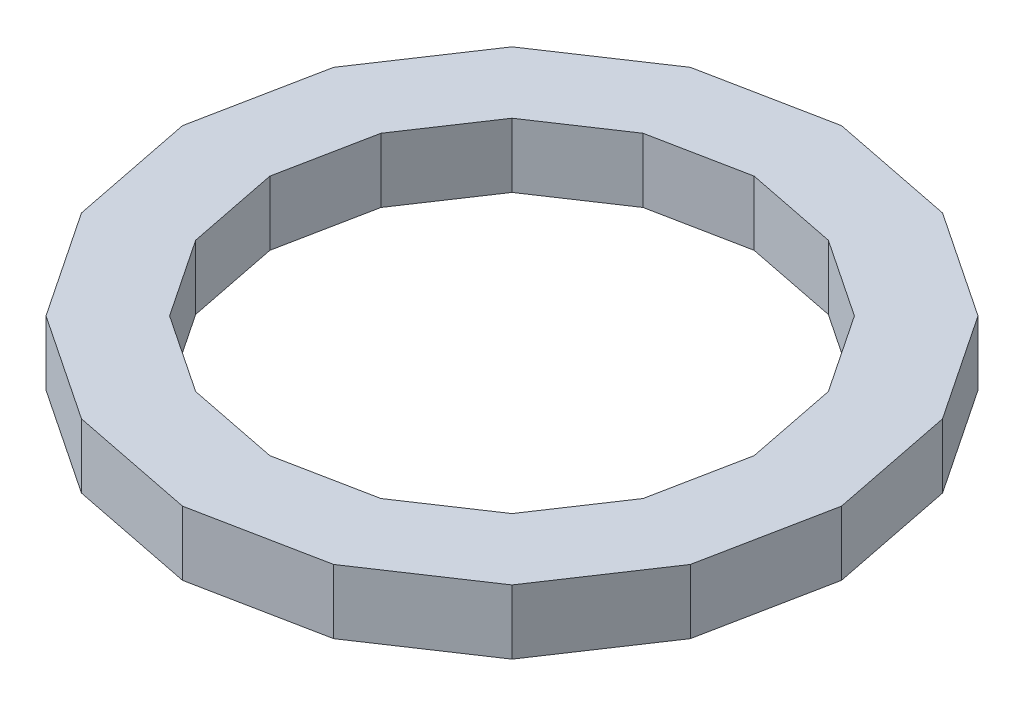
ISO-10303-21;
HEADER;
FILE_DESCRIPTION(('STEP AP214'),'2;1');
FILE_NAME('part.step','',(''),(''),'','','');
FILE_SCHEMA(('AUTOMOTIVE_DESIGN { 1 0 10303 214 1 1 1 1 }'));
ENDSEC;
DATA;
#1=APPLICATION_CONTEXT('core data for automotive mechanical design processes');
#2=APPLICATION_PROTOCOL_DEFINITION('international standard','automotive_design',2000,#1);
#3=PRODUCT_CONTEXT('',#1,'mechanical');
#4=PRODUCT('Part','Part','',(#3));
#5=PRODUCT_RELATED_PRODUCT_CATEGORY('part','',(#4));
#6=PRODUCT_DEFINITION_FORMATION('','',#4);
#7=PRODUCT_DEFINITION_CONTEXT('part definition',#1,'design');
#8=PRODUCT_DEFINITION('design','',#6,#7);
#9=PRODUCT_DEFINITION_SHAPE('','',#8);
#10=(LENGTH_UNIT() NAMED_UNIT(*) SI_UNIT(.MILLI.,.METRE.));
#11=(NAMED_UNIT(*) PLANE_ANGLE_UNIT() SI_UNIT($,.RADIAN.));
#12=(NAMED_UNIT(*) SI_UNIT($,.STERADIAN.) SOLID_ANGLE_UNIT());
#13=UNCERTAINTY_MEASURE_WITH_UNIT(LENGTH_MEASURE(1.E-05),#10,'distance_accuracy_value','');
#14=(GEOMETRIC_REPRESENTATION_CONTEXT(3) GLOBAL_UNCERTAINTY_ASSIGNED_CONTEXT((#13)) GLOBAL_UNIT_ASSIGNED_CONTEXT((#10,
#11,#12)) REPRESENTATION_CONTEXT('',''));
#15=CARTESIAN_POINT('',(0.,0.,0.));
#16=DIRECTION('',(0.,0.,1.));
#17=DIRECTION('',(1.,0.,0.));
#18=AXIS2_PLACEMENT_3D('',#15,#16,#17);
#19=CARTESIAN_POINT('',(0.,19.05,0.));
#20=DIRECTION('',(0.,1.,0.));
#21=DIRECTION('',(0.,0.,1.));
#22=AXIS2_PLACEMENT_3D('',#19,#20,#21);
#23=PLANE('',#22);
#24=DIRECTION('',(0.195090322016117,0.,-0.980785280403233));
#25=VECTOR('',#24,1.);
#26=CARTESIAN_POINT('',(90.2141372901375,19.05,37.3679191833621));
#27=LINE('',#26,#25);
#28=CARTESIAN_POINT('',(90.2141372901375,19.05,37.3679191833621));
#29=VERTEX_POINT('',#28);
#30=CARTESIAN_POINT('',(97.6470785589515,19.05,-1.11681997236116E-12));
#31=VERTEX_POINT('',#30);
#32=EDGE_CURVE('E370',#29,#31,#27,.T.);
#33=ORIENTED_EDGE('',*,*,#32,.T.);
#34=DIRECTION('',(-0.195090322016139,0.,-0.980785280403228));
#35=VECTOR('',#34,1.);
#36=CARTESIAN_POINT('',(97.6470785589515,19.05,-1.11681997236116E-12));
#37=LINE('',#36,#35);
#38=CARTESIAN_POINT('',(90.2141372901366,19.05,-37.3679191833641));
#39=VERTEX_POINT('',#38);
#40=EDGE_CURVE('E373',#31,#39,#37,.T.);
#41=ORIENTED_EDGE('',*,*,#40,.T.);
#42=DIRECTION('',(-0.555570233019612,0.,-0.831469612302539));
#43=VECTOR('',#42,1.);
#44=CARTESIAN_POINT('',(90.2141372901366,19.05,-37.3679191833641));
#45=LINE('',#44,#43);
#46=CARTESIAN_POINT('',(69.0469114120894,19.05,-69.046911412091));
#47=VERTEX_POINT('',#46);
#48=EDGE_CURVE('E376',#39,#47,#45,.T.);
#49=ORIENTED_EDGE('',*,*,#48,.T.);
#50=DIRECTION('',(-0.831469612302551,0.,-0.555570233019593));
#51=VECTOR('',#50,1.);
#52=CARTESIAN_POINT('',(69.0469114120894,19.05,-69.046911412091));
#53=LINE('',#52,#51);
#54=CARTESIAN_POINT('',(37.3679191833621,19.05,-90.2141372901375));
#55=VERTEX_POINT('',#54);
#56=EDGE_CURVE('E378',#47,#55,#53,.T.);
#57=ORIENTED_EDGE('',*,*,#56,.T.);
#58=DIRECTION('',(-0.980785280403233,0.,-0.195090322016117));
#59=VECTOR('',#58,1.);
#60=CARTESIAN_POINT('',(37.3679191833621,19.05,-90.2141372901375));
#61=LINE('',#60,#59);
#62=CARTESIAN_POINT('',(-1.117159981544E-12,19.05,-97.6470785589515));
#63=VERTEX_POINT('',#62);
#64=EDGE_CURVE('E380',#55,#63,#61,.T.);
#65=ORIENTED_EDGE('',*,*,#64,.T.);
#66=DIRECTION('',(-0.980785280403228,0.,0.195090322016139));
#67=VECTOR('',#66,1.);
#68=CARTESIAN_POINT('',(-1.117159981544E-12,19.05,-97.6470785589515));
#69=LINE('',#68,#67);
#70=CARTESIAN_POINT('',(-37.3679191833642,19.05,-90.2141372901366));
#71=VERTEX_POINT('',#70);
#72=EDGE_CURVE('E382',#63,#71,#69,.T.);
#73=ORIENTED_EDGE('',*,*,#72,.T.);
#74=DIRECTION('',(-0.831469612302539,0.,0.555570233019612));
#75=VECTOR('',#74,1.);
#76=CARTESIAN_POINT('',(-37.3679191833642,19.05,-90.2141372901366));
#77=LINE('',#76,#75);
#78=CARTESIAN_POINT('',(-69.0469114120909,19.05,-69.0469114120894));
#79=VERTEX_POINT('',#78);
#80=EDGE_CURVE('E384',#71,#79,#77,.T.);
#81=ORIENTED_EDGE('',*,*,#80,.T.);
#82=DIRECTION('',(-0.555570233019592,0.,0.831469612302552));
#83=VECTOR('',#82,1.);
#84=CARTESIAN_POINT('',(-69.0469114120909,19.05,-69.0469114120894));
#85=LINE('',#84,#83);
#86=CARTESIAN_POINT('',(-90.2141372901375,19.05,-37.3679191833621));
#87=VERTEX_POINT('',#86);
#88=EDGE_CURVE('E386',#79,#87,#85,.T.);
#89=ORIENTED_EDGE('',*,*,#88,.T.);
#90=DIRECTION('',(-0.195090322016117,0.,0.980785280403233));
#91=VECTOR('',#90,1.);
#92=CARTESIAN_POINT('',(-90.2141372901375,19.05,-37.3679191833621));
#93=LINE('',#92,#91);
#94=CARTESIAN_POINT('',(-97.6470785589515,19.05,1.10328252344844E-12));
#95=VERTEX_POINT('',#94);
#96=EDGE_CURVE('E388',#87,#95,#93,.T.);
#97=ORIENTED_EDGE('',*,*,#96,.T.);
#98=DIRECTION('',(0.195090322016139,0.,0.980785280403228));
#99=VECTOR('',#98,1.);
#100=CARTESIAN_POINT('',(-97.6470785589515,19.05,1.10328252344844E-12));
#101=LINE('',#100,#99);
#102=CARTESIAN_POINT('',(-90.2141372901366,19.05,37.3679191833642));
#103=VERTEX_POINT('',#102);
#104=EDGE_CURVE('E390',#95,#103,#101,.T.);
#105=ORIENTED_EDGE('',*,*,#104,.T.);
#106=DIRECTION('',(0.555570233019612,0.,0.831469612302539));
#107=VECTOR('',#106,1.);
#108=CARTESIAN_POINT('',(-90.2141372901366,19.05,37.3679191833642));
#109=LINE('',#108,#107);
#110=CARTESIAN_POINT('',(-69.0469114120893,19.05,69.046911412091));
#111=VERTEX_POINT('',#110);
#112=EDGE_CURVE('E392',#103,#111,#109,.T.);
#113=ORIENTED_EDGE('',*,*,#112,.T.);
#114=DIRECTION('',(0.831469612302552,0.,0.555570233019593));
#115=VECTOR('',#114,1.);
#116=CARTESIAN_POINT('',(-69.0469114120893,19.05,69.046911412091));
#117=LINE('',#116,#115);
#118=CARTESIAN_POINT('',(-37.3679191833621,19.05,90.2141372901375));
#119=VERTEX_POINT('',#118);
#120=EDGE_CURVE('E394',#111,#119,#117,.T.);
#121=ORIENTED_EDGE('',*,*,#120,.T.);
#122=DIRECTION('',(0.980785280403233,0.,0.195090322016117));
#123=VECTOR('',#122,1.);
#124=CARTESIAN_POINT('',(-37.3679191833621,19.05,90.2141372901375));
#125=LINE('',#124,#123);
#126=CARTESIAN_POINT('',(1.09978986369539E-12,19.05,97.6470785589515));
#127=VERTEX_POINT('',#126);
#128=EDGE_CURVE('E396',#119,#127,#125,.T.);
#129=ORIENTED_EDGE('',*,*,#128,.T.);
#130=DIRECTION('',(0.980785280403228,0.,-0.195090322016139));
#131=VECTOR('',#130,1.);
#132=CARTESIAN_POINT('',(1.09978986369539E-12,19.05,97.6470785589515));
#133=LINE('',#132,#131);
#134=CARTESIAN_POINT('',(37.3679191833641,19.05,90.2141372901366));
#135=VERTEX_POINT('',#134);
#136=EDGE_CURVE('E398',#127,#135,#133,.T.);
#137=ORIENTED_EDGE('',*,*,#136,.T.);
#138=DIRECTION('',(0.831469612302539,0.,-0.555570233019612));
#139=VECTOR('',#138,1.);
#140=CARTESIAN_POINT('',(37.3679191833641,19.05,90.2141372901366));
#141=LINE('',#140,#139);
#142=CARTESIAN_POINT('',(69.0469114120909,19.05,69.0469114120894));
#143=VERTEX_POINT('',#142);
#144=EDGE_CURVE('E400',#135,#143,#141,.T.);
#145=ORIENTED_EDGE('',*,*,#144,.T.);
#146=DIRECTION('',(0.555570233019593,0.,-0.831469612302552));
#147=VECTOR('',#146,1.);
#148=CARTESIAN_POINT('',(69.0469114120909,19.05,69.0469114120894));
#149=LINE('',#148,#147);
#150=EDGE_CURVE('E402',#143,#29,#149,.T.);
#151=ORIENTED_EDGE('',*,*,#150,.T.);
#152=EDGE_LOOP('',(#33,#41,#49,#57,#65,#73,#81,#89,#97,#105,#113,#121,#129,#137,#145,#151));
#153=FACE_BOUND('',#152,.T.);
#154=DIRECTION('',(-0.19509032201614,0.,-0.980785280403228));
#155=VECTOR('',#154,1.);
#156=CARTESIAN_POINT('',(71.7494631404603,19.05,-8.46843984957841E-13));
#157=LINE('',#156,#155);
#158=CARTESIAN_POINT('',(71.7494631404603,19.05,-8.46843984957841E-13));
#159=VERTEX_POINT('',#158);
#160=CARTESIAN_POINT('',(66.2878604641439,19.05,-27.4573308249446));
#161=VERTEX_POINT('',#160);
#162=EDGE_CURVE('E252',#159,#161,#157,.T.);
#163=ORIENTED_EDGE('',*,*,#162,.F.);
#164=DIRECTION('',(0.195090322016117,0.,-0.980785280403233));
#165=VECTOR('',#164,1.);
#166=CARTESIAN_POINT('',(66.2878604641445,19.05,27.457330824943));
#167=LINE('',#166,#165);
#168=CARTESIAN_POINT('',(66.2878604641445,19.05,27.457330824943));
#169=VERTEX_POINT('',#168);
#170=EDGE_CURVE('E244',#169,#159,#167,.T.);
#171=ORIENTED_EDGE('',*,*,#170,.F.);
#172=DIRECTION('',(0.555570233019592,0.,-0.831469612302552));
#173=VECTOR('',#172,1.);
#174=CARTESIAN_POINT('',(50.7345319331143,19.05,50.7345319331131));
#175=LINE('',#174,#173);
#176=CARTESIAN_POINT('',(50.7345319331143,19.05,50.7345319331131));
#177=VERTEX_POINT('',#176);
#178=EDGE_CURVE('E296',#177,#169,#175,.T.);
#179=ORIENTED_EDGE('',*,*,#178,.F.);
#180=DIRECTION('',(0.831469612302539,0.,-0.555570233019612));
#181=VECTOR('',#180,1.);
#182=CARTESIAN_POINT('',(27.4573308249446,19.05,66.2878604641439));
#183=LINE('',#182,#181);
#184=CARTESIAN_POINT('',(27.4573308249446,19.05,66.2878604641439));
#185=VERTEX_POINT('',#184);
#186=EDGE_CURVE('E294',#185,#177,#183,.T.);
#187=ORIENTED_EDGE('',*,*,#186,.F.);
#188=DIRECTION('',(0.980785280403228,0.,-0.19509032201614));
#189=VECTOR('',#188,1.);
#190=CARTESIAN_POINT('',(8.07495116465049E-13,19.05,71.7494631404603));
#191=LINE('',#190,#189);
#192=CARTESIAN_POINT('',(8.07495116465049E-13,19.05,71.7494631404603));
#193=VERTEX_POINT('',#192);
#194=EDGE_CURVE('E292',#193,#185,#191,.T.);
#195=ORIENTED_EDGE('',*,*,#194,.F.);
#196=DIRECTION('',(0.980785280403233,0.,0.195090322016117));
#197=VECTOR('',#196,1.);
#198=CARTESIAN_POINT('',(-27.457330824943,19.05,66.2878604641446));
#199=LINE('',#198,#197);
#200=CARTESIAN_POINT('',(-27.457330824943,19.05,66.2878604641446));
#201=VERTEX_POINT('',#200);
#202=EDGE_CURVE('E290',#201,#193,#199,.T.);
#203=ORIENTED_EDGE('',*,*,#202,.F.);
#204=DIRECTION('',(0.831469612302552,0.,0.555570233019592));
#205=VECTOR('',#204,1.);
#206=CARTESIAN_POINT('',(-50.7345319331131,19.05,50.7345319331143));
#207=LINE('',#206,#205);
#208=CARTESIAN_POINT('',(-50.7345319331131,19.05,50.7345319331143));
#209=VERTEX_POINT('',#208);
#210=EDGE_CURVE('E288',#209,#201,#207,.T.);
#211=ORIENTED_EDGE('',*,*,#210,.F.);
#212=DIRECTION('',(0.555570233019612,0.,0.831469612302539));
#213=VECTOR('',#212,1.);
#214=CARTESIAN_POINT('',(-66.2878604641439,19.05,27.4573308249446));
#215=LINE('',#214,#213);
#216=CARTESIAN_POINT('',(-66.2878604641439,19.05,27.4573308249446));
#217=VERTEX_POINT('',#216);
#218=EDGE_CURVE('E286',#217,#209,#215,.T.);
#219=ORIENTED_EDGE('',*,*,#218,.F.);
#220=DIRECTION('',(0.19509032201614,0.,0.980785280403228));
#221=VECTOR('',#220,1.);
#222=CARTESIAN_POINT('',(-71.7494631404603,19.05,8.4472876212261E-13));
#223=LINE('',#222,#221);
#224=CARTESIAN_POINT('',(-71.7494631404603,19.05,8.4472876212261E-13));
#225=VERTEX_POINT('',#224);
#226=EDGE_CURVE('E283',#225,#217,#223,.T.);
#227=ORIENTED_EDGE('',*,*,#226,.F.);
#228=DIRECTION('',(-0.195090322016117,0.,0.980785280403233));
#229=VECTOR('',#228,1.);
#230=CARTESIAN_POINT('',(-66.2878604641445,19.05,-27.457330824943));
#231=LINE('',#230,#229);
#232=CARTESIAN_POINT('',(-66.2878604641445,19.05,-27.457330824943));
#233=VERTEX_POINT('',#232);
#234=EDGE_CURVE('E281',#233,#225,#231,.T.);
#235=ORIENTED_EDGE('',*,*,#234,.F.);
#236=DIRECTION('',(-0.555570233019592,0.,0.831469612302552));
#237=VECTOR('',#236,1.);
#238=CARTESIAN_POINT('',(-50.7345319331143,19.05,-50.7345319331131));
#239=LINE('',#238,#237);
#240=CARTESIAN_POINT('',(-50.7345319331143,19.05,-50.7345319331131));
#241=VERTEX_POINT('',#240);
#242=EDGE_CURVE('E278',#241,#233,#239,.T.);
#243=ORIENTED_EDGE('',*,*,#242,.F.);
#244=DIRECTION('',(-0.831469612302539,0.,0.555570233019612));
#245=VECTOR('',#244,1.);
#246=CARTESIAN_POINT('',(-27.4573308249446,19.05,-66.2878604641439));
#247=LINE('',#246,#245);
#248=CARTESIAN_POINT('',(-27.4573308249446,19.05,-66.2878604641439));
#249=VERTEX_POINT('',#248);
#250=EDGE_CURVE('E275',#249,#241,#247,.T.);
#251=ORIENTED_EDGE('',*,*,#250,.F.);
#252=DIRECTION('',(-0.980785280403228,0.,0.19509032201614));
#253=VECTOR('',#252,1.);
#254=CARTESIAN_POINT('',(-8.74570717381003E-13,19.05,-71.7494631404602));
#255=LINE('',#254,#253);
#256=CARTESIAN_POINT('',(-8.74570717381003E-13,19.05,-71.7494631404602));
#257=VERTEX_POINT('',#256);
#258=EDGE_CURVE('E273',#257,#249,#255,.T.);
#259=ORIENTED_EDGE('',*,*,#258,.F.);
#260=DIRECTION('',(-0.980785280403233,0.,-0.195090322016117));
#261=VECTOR('',#260,1.);
#262=CARTESIAN_POINT('',(27.4573308249431,19.05,-66.2878604641445));
#263=LINE('',#262,#261);
#264=CARTESIAN_POINT('',(27.4573308249431,19.05,-66.2878604641445));
#265=VERTEX_POINT('',#264);
#266=EDGE_CURVE('E271',#265,#257,#263,.T.);
#267=ORIENTED_EDGE('',*,*,#266,.F.);
#268=DIRECTION('',(-0.831469612302552,0.,-0.555570233019593));
#269=VECTOR('',#268,1.);
#270=CARTESIAN_POINT('',(50.7345319331131,19.05,-50.7345319331143));
#271=LINE('',#270,#269);
#272=CARTESIAN_POINT('',(50.7345319331131,19.05,-50.7345319331143));
#273=VERTEX_POINT('',#272);
#274=EDGE_CURVE('E267',#273,#265,#271,.T.);
#275=ORIENTED_EDGE('',*,*,#274,.F.);
#276=DIRECTION('',(-0.555570233019612,0.,-0.831469612302538));
#277=VECTOR('',#276,1.);
#278=CARTESIAN_POINT('',(66.2878604641439,19.05,-27.4573308249446));
#279=LINE('',#278,#277);
#280=EDGE_CURVE('E265',#161,#273,#279,.T.);
#281=ORIENTED_EDGE('',*,*,#280,.F.);
#282=EDGE_LOOP('',(#163,#171,#179,#187,#195,#203,#211,#219,#227,#235,#243,#251,#259,#267,#275,#281));
#283=FACE_BOUND('',#282,.T.);
#284=ADVANCED_FACE('F35',(#153,#283),#23,.T.);
#285=CARTESIAN_POINT('',(0.,0.,0.));
#286=DIRECTION('',(0.,1.,0.));
#287=DIRECTION('',(0.,0.,1.));
#288=AXIS2_PLACEMENT_3D('',#285,#286,#287);
#289=PLANE('',#288);
#290=DIRECTION('',(0.195090322016117,0.,-0.980785280403233));
#291=VECTOR('',#290,1.);
#292=CARTESIAN_POINT('',(90.2141372901375,0.,37.3679191833621));
#293=LINE('',#292,#291);
#294=CARTESIAN_POINT('',(90.2141372901375,0.,37.3679191833621));
#295=VERTEX_POINT('',#294);
#296=CARTESIAN_POINT('',(97.6470785589515,0.,-1.11681997236116E-12));
#297=VERTEX_POINT('',#296);
#298=EDGE_CURVE('E260',#295,#297,#293,.T.);
#299=ORIENTED_EDGE('',*,*,#298,.F.);
#300=DIRECTION('',(0.555570233019593,0.,-0.831469612302552));
#301=VECTOR('',#300,1.);
#302=CARTESIAN_POINT('',(69.0469114120909,0.,69.0469114120894));
#303=LINE('',#302,#301);
#304=CARTESIAN_POINT('',(69.0469114120909,0.,69.0469114120894));
#305=VERTEX_POINT('',#304);
#306=EDGE_CURVE('E374',#305,#295,#303,.T.);
#307=ORIENTED_EDGE('',*,*,#306,.F.);
#308=DIRECTION('',(0.831469612302539,0.,-0.555570233019612));
#309=VECTOR('',#308,1.);
#310=CARTESIAN_POINT('',(37.3679191833641,0.,90.2141372901366));
#311=LINE('',#310,#309);
#312=CARTESIAN_POINT('',(37.3679191833641,0.,90.2141372901366));
#313=VERTEX_POINT('',#312);
#314=EDGE_CURVE('E436',#313,#305,#311,.T.);
#315=ORIENTED_EDGE('',*,*,#314,.F.);
#316=DIRECTION('',(0.980785280403228,0.,-0.195090322016139));
#317=VECTOR('',#316,1.);
#318=CARTESIAN_POINT('',(1.09978986369539E-12,0.,97.6470785589515));
#319=LINE('',#318,#317);
#320=CARTESIAN_POINT('',(1.09978986369539E-12,0.,97.6470785589515));
#321=VERTEX_POINT('',#320);
#322=EDGE_CURVE('E433',#321,#313,#319,.T.);
#323=ORIENTED_EDGE('',*,*,#322,.F.);
#324=DIRECTION('',(0.980785280403233,0.,0.195090322016117));
#325=VECTOR('',#324,1.);
#326=CARTESIAN_POINT('',(-37.3679191833621,0.,90.2141372901375));
#327=LINE('',#326,#325);
#328=CARTESIAN_POINT('',(-37.3679191833621,0.,90.2141372901375));
#329=VERTEX_POINT('',#328);
#330=EDGE_CURVE('E431',#329,#321,#327,.T.);
#331=ORIENTED_EDGE('',*,*,#330,.F.);
#332=DIRECTION('',(0.831469612302552,0.,0.555570233019593));
#333=VECTOR('',#332,1.);
#334=CARTESIAN_POINT('',(-69.0469114120893,0.,69.046911412091));
#335=LINE('',#334,#333);
#336=CARTESIAN_POINT('',(-69.0469114120893,0.,69.046911412091));
#337=VERTEX_POINT('',#336);
#338=EDGE_CURVE('E429',#337,#329,#335,.T.);
#339=ORIENTED_EDGE('',*,*,#338,.F.);
#340=DIRECTION('',(0.555570233019612,0.,0.831469612302539));
#341=VECTOR('',#340,1.);
#342=CARTESIAN_POINT('',(-90.2141372901366,0.,37.3679191833642));
#343=LINE('',#342,#341);
#344=CARTESIAN_POINT('',(-90.2141372901366,0.,37.3679191833642));
#345=VERTEX_POINT('',#344);
#346=EDGE_CURVE('E427',#345,#337,#343,.T.);
#347=ORIENTED_EDGE('',*,*,#346,.F.);
#348=DIRECTION('',(0.195090322016139,0.,0.980785280403228));
#349=VECTOR('',#348,1.);
#350=CARTESIAN_POINT('',(-97.6470785589515,0.,1.10328252344844E-12));
#351=LINE('',#350,#349);
#352=CARTESIAN_POINT('',(-97.6470785589515,0.,1.10328252344844E-12));
#353=VERTEX_POINT('',#352);
#354=EDGE_CURVE('E425',#353,#345,#351,.T.);
#355=ORIENTED_EDGE('',*,*,#354,.F.);
#356=DIRECTION('',(-0.195090322016117,0.,0.980785280403233));
#357=VECTOR('',#356,1.);
#358=CARTESIAN_POINT('',(-90.2141372901375,0.,-37.3679191833621));
#359=LINE('',#358,#357);
#360=CARTESIAN_POINT('',(-90.2141372901375,0.,-37.3679191833621));
#361=VERTEX_POINT('',#360);
#362=EDGE_CURVE('E422',#361,#353,#359,.T.);
#363=ORIENTED_EDGE('',*,*,#362,.F.);
#364=DIRECTION('',(-0.555570233019592,0.,0.831469612302552));
#365=VECTOR('',#364,1.);
#366=CARTESIAN_POINT('',(-69.0469114120909,0.,-69.0469114120894));
#367=LINE('',#366,#365);
#368=CARTESIAN_POINT('',(-69.0469114120909,0.,-69.0469114120894));
#369=VERTEX_POINT('',#368);
#370=EDGE_CURVE('E420',#369,#361,#367,.T.);
#371=ORIENTED_EDGE('',*,*,#370,.F.);
#372=DIRECTION('',(-0.831469612302539,0.,0.555570233019612));
#373=VECTOR('',#372,1.);
#374=CARTESIAN_POINT('',(-37.3679191833642,0.,-90.2141372901366));
#375=LINE('',#374,#373);
#376=CARTESIAN_POINT('',(-37.3679191833642,0.,-90.2141372901366));
#377=VERTEX_POINT('',#376);
#378=EDGE_CURVE('E418',#377,#369,#375,.T.);
#379=ORIENTED_EDGE('',*,*,#378,.F.);
#380=DIRECTION('',(-0.980785280403228,0.,0.195090322016139));
#381=VECTOR('',#380,1.);
#382=CARTESIAN_POINT('',(-1.117159981544E-12,0.,-97.6470785589515));
#383=LINE('',#382,#381);
#384=CARTESIAN_POINT('',(-1.117159981544E-12,0.,-97.6470785589515));
#385=VERTEX_POINT('',#384);
#386=EDGE_CURVE('E416',#385,#377,#383,.T.);
#387=ORIENTED_EDGE('',*,*,#386,.F.);
#388=DIRECTION('',(-0.980785280403233,0.,-0.195090322016117));
#389=VECTOR('',#388,1.);
#390=CARTESIAN_POINT('',(37.3679191833621,0.,-90.2141372901375));
#391=LINE('',#390,#389);
#392=CARTESIAN_POINT('',(37.3679191833621,0.,-90.2141372901375));
#393=VERTEX_POINT('',#392);
#394=EDGE_CURVE('E414',#393,#385,#391,.T.);
#395=ORIENTED_EDGE('',*,*,#394,.F.);
#396=DIRECTION('',(-0.831469612302551,0.,-0.555570233019593));
#397=VECTOR('',#396,1.);
#398=CARTESIAN_POINT('',(69.0469114120894,0.,-69.046911412091));
#399=LINE('',#398,#397);
#400=CARTESIAN_POINT('',(69.0469114120894,0.,-69.046911412091));
#401=VERTEX_POINT('',#400);
#402=EDGE_CURVE('E412',#401,#393,#399,.T.);
#403=ORIENTED_EDGE('',*,*,#402,.F.);
#404=DIRECTION('',(-0.555570233019612,0.,-0.831469612302539));
#405=VECTOR('',#404,1.);
#406=CARTESIAN_POINT('',(90.2141372901366,0.,-37.3679191833641));
#407=LINE('',#406,#405);
#408=CARTESIAN_POINT('',(90.2141372901366,0.,-37.3679191833641));
#409=VERTEX_POINT('',#408);
#410=EDGE_CURVE('E409',#409,#401,#407,.T.);
#411=ORIENTED_EDGE('',*,*,#410,.F.);
#412=DIRECTION('',(-0.195090322016139,0.,-0.980785280403228));
#413=VECTOR('',#412,1.);
#414=CARTESIAN_POINT('',(97.6470785589515,0.,-1.11681997236116E-12));
#415=LINE('',#414,#413);
#416=EDGE_CURVE('E407',#297,#409,#415,.T.);
#417=ORIENTED_EDGE('',*,*,#416,.F.);
#418=EDGE_LOOP('',(#299,#307,#315,#323,#331,#339,#347,#355,#363,#371,#379,#387,#395,#403,#411,#417));
#419=FACE_BOUND('',#418,.T.);
#420=DIRECTION('',(0.195090322016117,0.,-0.980785280403233));
#421=VECTOR('',#420,1.);
#422=CARTESIAN_POINT('',(66.2878604641445,0.,27.457330824943));
#423=LINE('',#422,#421);
#424=CARTESIAN_POINT('',(66.2878604641446,0.,27.457330824943));
#425=VERTEX_POINT('',#424);
#426=CARTESIAN_POINT('',(71.7494631404603,0.,-8.46843984957841E-13));
#427=VERTEX_POINT('',#426);
#428=EDGE_CURVE('E58',#425,#427,#423,.T.);
#429=ORIENTED_EDGE('',*,*,#428,.T.);
#430=DIRECTION('',(-0.19509032201614,0.,-0.980785280403228));
#431=VECTOR('',#430,1.);
#432=CARTESIAN_POINT('',(71.7494631404603,0.,-8.46843984957841E-13));
#433=LINE('',#432,#431);
#434=CARTESIAN_POINT('',(66.2878604641439,0.,-27.4573308249446));
#435=VERTEX_POINT('',#434);
#436=EDGE_CURVE('E259',#427,#435,#433,.T.);
#437=ORIENTED_EDGE('',*,*,#436,.T.);
#438=DIRECTION('',(-0.555570233019612,0.,-0.831469612302538));
#439=VECTOR('',#438,1.);
#440=CARTESIAN_POINT('',(66.2878604641439,0.,-27.4573308249446));
#441=LINE('',#440,#439);
#442=CARTESIAN_POINT('',(50.7345319331131,0.,-50.7345319331143));
#443=VERTEX_POINT('',#442);
#444=EDGE_CURVE('E300',#435,#443,#441,.T.);
#445=ORIENTED_EDGE('',*,*,#444,.T.);
#446=DIRECTION('',(-0.831469612302552,0.,-0.555570233019593));
#447=VECTOR('',#446,1.);
#448=CARTESIAN_POINT('',(50.7345319331131,0.,-50.7345319331143));
#449=LINE('',#448,#447);
#450=CARTESIAN_POINT('',(27.4573308249431,0.,-66.2878604641445));
#451=VERTEX_POINT('',#450);
#452=EDGE_CURVE('E303',#443,#451,#449,.T.);
#453=ORIENTED_EDGE('',*,*,#452,.T.);
#454=DIRECTION('',(-0.980785280403233,0.,-0.195090322016117));
#455=VECTOR('',#454,1.);
#456=CARTESIAN_POINT('',(27.4573308249431,0.,-66.2878604641445));
#457=LINE('',#456,#455);
#458=CARTESIAN_POINT('',(-8.74570717381003E-13,0.,-71.7494631404602));
#459=VERTEX_POINT('',#458);
#460=EDGE_CURVE('E307',#451,#459,#457,.T.);
#461=ORIENTED_EDGE('',*,*,#460,.T.);
#462=DIRECTION('',(-0.980785280403228,0.,0.19509032201614));
#463=VECTOR('',#462,1.);
#464=CARTESIAN_POINT('',(-8.74570717381003E-13,0.,-71.7494631404602));
#465=LINE('',#464,#463);
#466=CARTESIAN_POINT('',(-27.4573308249446,0.,-66.2878604641439));
#467=VERTEX_POINT('',#466);
#468=EDGE_CURVE('E310',#459,#467,#465,.T.);
#469=ORIENTED_EDGE('',*,*,#468,.T.);
#470=DIRECTION('',(-0.831469612302539,0.,0.555570233019612));
#471=VECTOR('',#470,1.);
#472=CARTESIAN_POINT('',(-27.4573308249446,0.,-66.2878604641439));
#473=LINE('',#472,#471);
#474=CARTESIAN_POINT('',(-50.7345319331143,0.,-50.7345319331131));
#475=VERTEX_POINT('',#474);
#476=EDGE_CURVE('E313',#467,#475,#473,.T.);
#477=ORIENTED_EDGE('',*,*,#476,.T.);
#478=DIRECTION('',(-0.555570233019592,0.,0.831469612302552));
#479=VECTOR('',#478,1.);
#480=CARTESIAN_POINT('',(-50.7345319331143,0.,-50.7345319331131));
#481=LINE('',#480,#479);
#482=CARTESIAN_POINT('',(-66.2878604641445,0.,-27.457330824943));
#483=VERTEX_POINT('',#482);
#484=EDGE_CURVE('E316',#475,#483,#481,.T.);
#485=ORIENTED_EDGE('',*,*,#484,.T.);
#486=DIRECTION('',(-0.195090322016117,0.,0.980785280403233));
#487=VECTOR('',#486,1.);
#488=CARTESIAN_POINT('',(-66.2878604641445,0.,-27.457330824943));
#489=LINE('',#488,#487);
#490=CARTESIAN_POINT('',(-71.7494631404603,0.,8.4472876212261E-13));
#491=VERTEX_POINT('',#490);
#492=EDGE_CURVE('E319',#483,#491,#489,.T.);
#493=ORIENTED_EDGE('',*,*,#492,.T.);
#494=DIRECTION('',(0.19509032201614,0.,0.980785280403228));
#495=VECTOR('',#494,1.);
#496=CARTESIAN_POINT('',(-71.7494631404603,0.,8.4472876212261E-13));
#497=LINE('',#496,#495);
#498=CARTESIAN_POINT('',(-66.2878604641439,0.,27.4573308249446));
#499=VERTEX_POINT('',#498);
#500=EDGE_CURVE('E322',#491,#499,#497,.T.);
#501=ORIENTED_EDGE('',*,*,#500,.T.);
#502=DIRECTION('',(0.555570233019612,0.,0.831469612302539));
#503=VECTOR('',#502,1.);
#504=CARTESIAN_POINT('',(-66.2878604641439,0.,27.4573308249446));
#505=LINE('',#504,#503);
#506=CARTESIAN_POINT('',(-50.7345319331131,0.,50.7345319331143));
#507=VERTEX_POINT('',#506);
#508=EDGE_CURVE('E325',#499,#507,#505,.T.);
#509=ORIENTED_EDGE('',*,*,#508,.T.);
#510=DIRECTION('',(0.831469612302552,0.,0.555570233019592));
#511=VECTOR('',#510,1.);
#512=CARTESIAN_POINT('',(-50.7345319331131,0.,50.7345319331143));
#513=LINE('',#512,#511);
#514=CARTESIAN_POINT('',(-27.457330824943,0.,66.2878604641446));
#515=VERTEX_POINT('',#514);
#516=EDGE_CURVE('E328',#507,#515,#513,.T.);
#517=ORIENTED_EDGE('',*,*,#516,.T.);
#518=DIRECTION('',(0.980785280403233,0.,0.195090322016117));
#519=VECTOR('',#518,1.);
#520=CARTESIAN_POINT('',(-27.457330824943,0.,66.2878604641446));
#521=LINE('',#520,#519);
#522=CARTESIAN_POINT('',(8.07495116465049E-13,0.,71.7494631404603));
#523=VERTEX_POINT('',#522);
#524=EDGE_CURVE('E331',#515,#523,#521,.T.);
#525=ORIENTED_EDGE('',*,*,#524,.T.);
#526=DIRECTION('',(0.980785280403228,0.,-0.19509032201614));
#527=VECTOR('',#526,1.);
#528=CARTESIAN_POINT('',(8.07495116465049E-13,0.,71.7494631404603));
#529=LINE('',#528,#527);
#530=CARTESIAN_POINT('',(27.4573308249446,0.,66.2878604641439));
#531=VERTEX_POINT('',#530);
#532=EDGE_CURVE('E335',#523,#531,#529,.T.);
#533=ORIENTED_EDGE('',*,*,#532,.T.);
#534=DIRECTION('',(0.831469612302539,0.,-0.555570233019612));
#535=VECTOR('',#534,1.);
#536=CARTESIAN_POINT('',(27.4573308249446,0.,66.2878604641439));
#537=LINE('',#536,#535);
#538=CARTESIAN_POINT('',(50.7345319331143,0.,50.7345319331131));
#539=VERTEX_POINT('',#538);
#540=EDGE_CURVE('E338',#531,#539,#537,.T.);
#541=ORIENTED_EDGE('',*,*,#540,.T.);
#542=DIRECTION('',(0.555570233019592,0.,-0.831469612302552));
#543=VECTOR('',#542,1.);
#544=CARTESIAN_POINT('',(50.7345319331143,0.,50.7345319331131));
#545=LINE('',#544,#543);
#546=EDGE_CURVE('E253',#539,#425,#545,.T.);
#547=ORIENTED_EDGE('',*,*,#546,.T.);
#548=EDGE_LOOP('',(#429,#437,#445,#453,#461,#469,#477,#485,#493,#501,#509,#517,#525,#533,#541,#547));
#549=FACE_BOUND('',#548,.T.);
#550=ADVANCED_FACE('F496',(#419,#549),#289,.F.);
#551=CARTESIAN_POINT('',(90.2141372901375,19.05,37.3679191833621));
#552=DIRECTION('',(-0.980785280403233,0.,-0.195090322016117));
#553=DIRECTION('',(-0.195090322016117,0.,0.980785280403233));
#554=AXIS2_PLACEMENT_3D('',#551,#552,#553);
#555=PLANE('',#554);
#556=ORIENTED_EDGE('',*,*,#298,.T.);
#557=DIRECTION('',(0.,-1.,0.));
#558=VECTOR('',#557,1.);
#559=CARTESIAN_POINT('',(97.6470785589515,19.05,-1.11681997236116E-12));
#560=LINE('',#559,#558);
#561=EDGE_CURVE('E11',#31,#297,#560,.T.);
#562=ORIENTED_EDGE('',*,*,#561,.F.);
#563=ORIENTED_EDGE('',*,*,#32,.F.);
#564=DIRECTION('',(0.,-1.,0.));
#565=VECTOR('',#564,1.);
#566=CARTESIAN_POINT('',(90.2141372901375,19.05,37.3679191833621));
#567=LINE('',#566,#565);
#568=EDGE_CURVE('E404',#29,#295,#567,.T.);
#569=ORIENTED_EDGE('',*,*,#568,.T.);
#570=EDGE_LOOP('',(#556,#562,#563,#569));
#571=FACE_BOUND('',#570,.T.);
#572=ADVANCED_FACE('F37',(#571),#555,.F.);
#573=CARTESIAN_POINT('',(97.6470785589515,19.05,-1.11681997236116E-12));
#574=DIRECTION('',(-0.980785280403228,0.,0.195090322016139));
#575=DIRECTION('',(0.195090322016139,0.,0.980785280403228));
#576=AXIS2_PLACEMENT_3D('',#573,#574,#575);
#577=PLANE('',#576);
#578=ORIENTED_EDGE('',*,*,#416,.T.);
#579=DIRECTION('',(0.,-1.,0.));
#580=VECTOR('',#579,1.);
#581=CARTESIAN_POINT('',(90.2141372901366,19.05,-37.3679191833641));
#582=LINE('',#581,#580);
#583=EDGE_CURVE('E43',#39,#409,#582,.T.);
#584=ORIENTED_EDGE('',*,*,#583,.F.);
#585=ORIENTED_EDGE('',*,*,#40,.F.);
#586=ORIENTED_EDGE('',*,*,#561,.T.);
#587=EDGE_LOOP('',(#578,#584,#585,#586));
#588=FACE_BOUND('',#587,.T.);
#589=ADVANCED_FACE('F513',(#588),#577,.F.);
#590=CARTESIAN_POINT('',(90.2141372901366,19.05,-37.3679191833641));
#591=DIRECTION('',(-0.831469612302539,0.,0.555570233019612));
#592=DIRECTION('',(0.555570233019612,0.,0.831469612302539));
#593=AXIS2_PLACEMENT_3D('',#590,#591,#592);
#594=PLANE('',#593);
#595=ORIENTED_EDGE('',*,*,#410,.T.);
#596=DIRECTION('',(0.,-1.,0.));
#597=VECTOR('',#596,1.);
#598=CARTESIAN_POINT('',(69.0469114120894,19.05,-69.046911412091));
#599=LINE('',#598,#597);
#600=EDGE_CURVE('E483',#47,#401,#599,.T.);
#601=ORIENTED_EDGE('',*,*,#600,.F.);
#602=ORIENTED_EDGE('',*,*,#48,.F.);
#603=ORIENTED_EDGE('',*,*,#583,.T.);
#604=EDGE_LOOP('',(#595,#601,#602,#603));
#605=FACE_BOUND('',#604,.T.);
#606=ADVANCED_FACE('F490',(#605),#594,.F.);
#607=CARTESIAN_POINT('',(69.0469114120894,19.05,-69.046911412091));
#608=DIRECTION('',(-0.555570233019593,0.,0.831469612302551));
#609=DIRECTION('',(0.831469612302551,0.,0.555570233019593));
#610=AXIS2_PLACEMENT_3D('',#607,#608,#609);
#611=PLANE('',#610);
#612=ORIENTED_EDGE('',*,*,#402,.T.);
#613=DIRECTION('',(0.,-1.,0.));
#614=VECTOR('',#613,1.);
#615=CARTESIAN_POINT('',(37.3679191833621,19.05,-90.2141372901375));
#616=LINE('',#615,#614);
#617=EDGE_CURVE('E480',#55,#393,#616,.T.);
#618=ORIENTED_EDGE('',*,*,#617,.F.);
#619=ORIENTED_EDGE('',*,*,#56,.F.);
#620=ORIENTED_EDGE('',*,*,#600,.T.);
#621=EDGE_LOOP('',(#612,#618,#619,#620));
#622=FACE_BOUND('',#621,.T.);
#623=ADVANCED_FACE('F502',(#622),#611,.F.);
#624=CARTESIAN_POINT('',(37.3679191833621,19.05,-90.2141372901375));
#625=DIRECTION('',(-0.195090322016117,0.,0.980785280403233));
#626=DIRECTION('',(0.980785280403233,0.,0.195090322016117));
#627=AXIS2_PLACEMENT_3D('',#624,#625,#626);
#628=PLANE('',#627);
#629=ORIENTED_EDGE('',*,*,#394,.T.);
#630=DIRECTION('',(0.,-1.,0.));
#631=VECTOR('',#630,1.);
#632=CARTESIAN_POINT('',(-1.117159981544E-12,19.05,-97.6470785589515));
#633=LINE('',#632,#631);
#634=EDGE_CURVE('E477',#63,#385,#633,.T.);
#635=ORIENTED_EDGE('',*,*,#634,.F.);
#636=ORIENTED_EDGE('',*,*,#64,.F.);
#637=ORIENTED_EDGE('',*,*,#617,.T.);
#638=EDGE_LOOP('',(#629,#635,#636,#637));
#639=FACE_BOUND('',#638,.T.);
#640=ADVANCED_FACE('F506',(#639),#628,.F.);
#641=CARTESIAN_POINT('',(-1.117159981544E-12,19.05,-97.6470785589515));
#642=DIRECTION('',(0.195090322016139,0.,0.980785280403228));
#643=DIRECTION('',(0.980785280403228,0.,-0.195090322016139));
#644=AXIS2_PLACEMENT_3D('',#641,#642,#643);
#645=PLANE('',#644);
#646=ORIENTED_EDGE('',*,*,#386,.T.);
#647=DIRECTION('',(0.,-1.,0.));
#648=VECTOR('',#647,1.);
#649=CARTESIAN_POINT('',(-37.3679191833642,19.05,-90.2141372901366));
#650=LINE('',#649,#648);
#651=EDGE_CURVE('E474',#71,#377,#650,.T.);
#652=ORIENTED_EDGE('',*,*,#651,.F.);
#653=ORIENTED_EDGE('',*,*,#72,.F.);
#654=ORIENTED_EDGE('',*,*,#634,.T.);
#655=EDGE_LOOP('',(#646,#652,#653,#654));
#656=FACE_BOUND('',#655,.T.);
#657=ADVANCED_FACE('F566',(#656),#645,.F.);
#658=CARTESIAN_POINT('',(-37.3679191833642,19.05,-90.2141372901366));
#659=DIRECTION('',(0.555570233019612,0.,0.831469612302539));
#660=DIRECTION('',(0.831469612302539,0.,-0.555570233019612));
#661=AXIS2_PLACEMENT_3D('',#658,#659,#660);
#662=PLANE('',#661);
#663=ORIENTED_EDGE('',*,*,#378,.T.);
#664=DIRECTION('',(0.,-1.,0.));
#665=VECTOR('',#664,1.);
#666=CARTESIAN_POINT('',(-69.0469114120909,19.05,-69.0469114120894));
#667=LINE('',#666,#665);
#668=EDGE_CURVE('E471',#79,#369,#667,.T.);
#669=ORIENTED_EDGE('',*,*,#668,.F.);
#670=ORIENTED_EDGE('',*,*,#80,.F.);
#671=ORIENTED_EDGE('',*,*,#651,.T.);
#672=EDGE_LOOP('',(#663,#669,#670,#671));
#673=FACE_BOUND('',#672,.T.);
#674=ADVANCED_FACE('F563',(#673),#662,.F.);
#675=CARTESIAN_POINT('',(-69.0469114120909,19.05,-69.0469114120894));
#676=DIRECTION('',(0.831469612302552,0.,0.555570233019592));
#677=DIRECTION('',(0.555570233019592,0.,-0.831469612302552));
#678=AXIS2_PLACEMENT_3D('',#675,#676,#677);
#679=PLANE('',#678);
#680=ORIENTED_EDGE('',*,*,#370,.T.);
#681=DIRECTION('',(0.,-1.,0.));
#682=VECTOR('',#681,1.);
#683=CARTESIAN_POINT('',(-90.2141372901375,19.05,-37.3679191833621));
#684=LINE('',#683,#682);
#685=EDGE_CURVE('E467',#87,#361,#684,.T.);
#686=ORIENTED_EDGE('',*,*,#685,.F.);
#687=ORIENTED_EDGE('',*,*,#88,.F.);
#688=ORIENTED_EDGE('',*,*,#668,.T.);
#689=EDGE_LOOP('',(#680,#686,#687,#688));
#690=FACE_BOUND('',#689,.T.);
#691=ADVANCED_FACE('F559',(#690),#679,.F.);
#692=CARTESIAN_POINT('',(-90.2141372901375,19.05,-37.3679191833621));
#693=DIRECTION('',(0.980785280403233,0.,0.195090322016117));
#694=DIRECTION('',(0.195090322016117,0.,-0.980785280403233));
#695=AXIS2_PLACEMENT_3D('',#692,#693,#694);
#696=PLANE('',#695);
#697=ORIENTED_EDGE('',*,*,#362,.T.);
#698=DIRECTION('',(0.,-1.,0.));
#699=VECTOR('',#698,1.);
#700=CARTESIAN_POINT('',(-97.6470785589515,19.05,1.10328252344844E-12));
#701=LINE('',#700,#699);
#702=EDGE_CURVE('E464',#95,#353,#701,.T.);
#703=ORIENTED_EDGE('',*,*,#702,.F.);
#704=ORIENTED_EDGE('',*,*,#96,.F.);
#705=ORIENTED_EDGE('',*,*,#685,.T.);
#706=EDGE_LOOP('',(#697,#703,#704,#705));
#707=FACE_BOUND('',#706,.T.);
#708=ADVANCED_FACE('F555',(#707),#696,.F.);
#709=CARTESIAN_POINT('',(-97.6470785589515,19.05,1.10328252344844E-12));
#710=DIRECTION('',(0.980785280403228,0.,-0.19509032201614));
#711=DIRECTION('',(-0.19509032201614,0.,-0.980785280403228));
#712=AXIS2_PLACEMENT_3D('',#709,#710,#711);
#713=PLANE('',#712);
#714=ORIENTED_EDGE('',*,*,#354,.T.);
#715=DIRECTION('',(0.,-1.,0.));
#716=VECTOR('',#715,1.);
#717=CARTESIAN_POINT('',(-90.2141372901366,19.05,37.3679191833642));
#718=LINE('',#717,#716);
#719=EDGE_CURVE('E460',#103,#345,#718,.T.);
#720=ORIENTED_EDGE('',*,*,#719,.F.);
#721=ORIENTED_EDGE('',*,*,#104,.F.);
#722=ORIENTED_EDGE('',*,*,#702,.T.);
#723=EDGE_LOOP('',(#714,#720,#721,#722));
#724=FACE_BOUND('',#723,.T.);
#725=ADVANCED_FACE('F550',(#724),#713,.F.);
#726=CARTESIAN_POINT('',(-90.2141372901366,19.05,37.3679191833642));
#727=DIRECTION('',(0.831469612302539,0.,-0.555570233019612));
#728=DIRECTION('',(-0.555570233019612,0.,-0.831469612302539));
#729=AXIS2_PLACEMENT_3D('',#726,#727,#728);
#730=PLANE('',#729);
#731=ORIENTED_EDGE('',*,*,#346,.T.);
#732=DIRECTION('',(0.,-1.,0.));
#733=VECTOR('',#732,1.);
#734=CARTESIAN_POINT('',(-69.0469114120893,19.05,69.046911412091));
#735=LINE('',#734,#733);
#736=EDGE_CURVE('E457',#111,#337,#735,.T.);
#737=ORIENTED_EDGE('',*,*,#736,.F.);
#738=ORIENTED_EDGE('',*,*,#112,.F.);
#739=ORIENTED_EDGE('',*,*,#719,.T.);
#740=EDGE_LOOP('',(#731,#737,#738,#739));
#741=FACE_BOUND('',#740,.T.);
#742=ADVANCED_FACE('F544',(#741),#730,.F.);
#743=CARTESIAN_POINT('',(-69.0469114120893,19.05,69.046911412091));
#744=DIRECTION('',(0.555570233019593,0.,-0.831469612302552));
#745=DIRECTION('',(-0.831469612302552,0.,-0.555570233019593));
#746=AXIS2_PLACEMENT_3D('',#743,#744,#745);
#747=PLANE('',#746);
#748=ORIENTED_EDGE('',*,*,#338,.T.);
#749=DIRECTION('',(0.,-1.,0.));
#750=VECTOR('',#749,1.);
#751=CARTESIAN_POINT('',(-37.3679191833621,19.05,90.2141372901375));
#752=LINE('',#751,#750);
#753=EDGE_CURVE('E453',#119,#329,#752,.T.);
#754=ORIENTED_EDGE('',*,*,#753,.F.);
#755=ORIENTED_EDGE('',*,*,#120,.F.);
#756=ORIENTED_EDGE('',*,*,#736,.T.);
#757=EDGE_LOOP('',(#748,#754,#755,#756));
#758=FACE_BOUND('',#757,.T.);
#759=ADVANCED_FACE('F540',(#758),#747,.F.);
#760=CARTESIAN_POINT('',(-37.3679191833621,19.05,90.2141372901375));
#761=DIRECTION('',(0.195090322016117,0.,-0.980785280403233));
#762=DIRECTION('',(-0.980785280403233,0.,-0.195090322016117));
#763=AXIS2_PLACEMENT_3D('',#760,#761,#762);
#764=PLANE('',#763);
#765=ORIENTED_EDGE('',*,*,#330,.T.);
#766=DIRECTION('',(0.,-1.,0.));
#767=VECTOR('',#766,1.);
#768=CARTESIAN_POINT('',(1.09978986369539E-12,19.05,97.6470785589515));
#769=LINE('',#768,#767);
#770=EDGE_CURVE('E449',#127,#321,#769,.T.);
#771=ORIENTED_EDGE('',*,*,#770,.F.);
#772=ORIENTED_EDGE('',*,*,#128,.F.);
#773=ORIENTED_EDGE('',*,*,#753,.T.);
#774=EDGE_LOOP('',(#765,#771,#772,#773));
#775=FACE_BOUND('',#774,.T.);
#776=ADVANCED_FACE('F535',(#775),#764,.F.);
#777=CARTESIAN_POINT('',(1.09978986369539E-12,19.05,97.6470785589515));
#778=DIRECTION('',(-0.195090322016139,0.,-0.980785280403228));
#779=DIRECTION('',(-0.980785280403228,0.,0.195090322016139));
#780=AXIS2_PLACEMENT_3D('',#777,#778,#779);
#781=PLANE('',#780);
#782=ORIENTED_EDGE('',*,*,#322,.T.);
#783=DIRECTION('',(0.,-1.,0.));
#784=VECTOR('',#783,1.);
#785=CARTESIAN_POINT('',(37.3679191833641,19.05,90.2141372901366));
#786=LINE('',#785,#784);
#787=EDGE_CURVE('E445',#135,#313,#786,.T.);
#788=ORIENTED_EDGE('',*,*,#787,.F.);
#789=ORIENTED_EDGE('',*,*,#136,.F.);
#790=ORIENTED_EDGE('',*,*,#770,.T.);
#791=EDGE_LOOP('',(#782,#788,#789,#790));
#792=FACE_BOUND('',#791,.T.);
#793=ADVANCED_FACE('F529',(#792),#781,.F.);
#794=CARTESIAN_POINT('',(37.3679191833641,19.05,90.2141372901366));
#795=DIRECTION('',(-0.555570233019612,0.,-0.831469612302539));
#796=DIRECTION('',(-0.831469612302539,0.,0.555570233019612));
#797=AXIS2_PLACEMENT_3D('',#794,#795,#796);
#798=PLANE('',#797);
#799=ORIENTED_EDGE('',*,*,#314,.T.);
#800=DIRECTION('',(0.,-1.,0.));
#801=VECTOR('',#800,1.);
#802=CARTESIAN_POINT('',(69.0469114120909,19.05,69.0469114120894));
#803=LINE('',#802,#801);
#804=EDGE_CURVE('E442',#143,#305,#803,.T.);
#805=ORIENTED_EDGE('',*,*,#804,.F.);
#806=ORIENTED_EDGE('',*,*,#144,.F.);
#807=ORIENTED_EDGE('',*,*,#787,.T.);
#808=EDGE_LOOP('',(#799,#805,#806,#807));
#809=FACE_BOUND('',#808,.T.);
#810=ADVANCED_FACE('F525',(#809),#798,.F.);
#811=CARTESIAN_POINT('',(69.0469114120909,19.05,69.0469114120894));
#812=DIRECTION('',(-0.831469612302551,0.,-0.555570233019593));
#813=DIRECTION('',(-0.555570233019593,0.,0.831469612302551));
#814=AXIS2_PLACEMENT_3D('',#811,#812,#813);
#815=PLANE('',#814);
#816=ORIENTED_EDGE('',*,*,#306,.T.);
#817=ORIENTED_EDGE('',*,*,#568,.F.);
#818=ORIENTED_EDGE('',*,*,#150,.F.);
#819=ORIENTED_EDGE('',*,*,#804,.T.);
#820=EDGE_LOOP('',(#816,#817,#818,#819));
#821=FACE_BOUND('',#820,.T.);
#822=ADVANCED_FACE('F520',(#821),#815,.F.);
#823=CARTESIAN_POINT('',(66.2878604641445,19.05,27.457330824943));
#824=DIRECTION('',(-0.980785280403233,0.,-0.195090322016117));
#825=DIRECTION('',(-0.195090322016117,0.,0.980785280403233));
#826=AXIS2_PLACEMENT_3D('',#823,#824,#825);
#827=PLANE('',#826);
#828=ORIENTED_EDGE('',*,*,#428,.F.);
#829=DIRECTION('',(0.,-1.,0.));
#830=VECTOR('',#829,1.);
#831=CARTESIAN_POINT('',(66.2878604641445,19.05,27.457330824943));
#832=LINE('',#831,#830);
#833=EDGE_CURVE('E248',#169,#425,#832,.T.);
#834=ORIENTED_EDGE('',*,*,#833,.F.);
#835=ORIENTED_EDGE('',*,*,#170,.T.);
#836=DIRECTION('',(0.,-1.,0.));
#837=VECTOR('',#836,1.);
#838=CARTESIAN_POINT('',(71.7494631404603,19.05,-8.46843984957841E-13));
#839=LINE('',#838,#837);
#840=EDGE_CURVE('E247',#159,#427,#839,.T.);
#841=ORIENTED_EDGE('',*,*,#840,.T.);
#842=EDGE_LOOP('',(#828,#834,#835,#841));
#843=FACE_BOUND('',#842,.T.);
#844=ADVANCED_FACE('F246',(#843),#827,.T.);
#845=CARTESIAN_POINT('',(71.7494631404603,19.05,-8.46843984957841E-13));
#846=DIRECTION('',(-0.980785280403228,0.,0.19509032201614));
#847=DIRECTION('',(0.19509032201614,0.,0.980785280403228));
#848=AXIS2_PLACEMENT_3D('',#845,#846,#847);
#849=PLANE('',#848);
#850=ORIENTED_EDGE('',*,*,#436,.F.);
#851=ORIENTED_EDGE('',*,*,#840,.F.);
#852=ORIENTED_EDGE('',*,*,#162,.T.);
#853=DIRECTION('',(0.,-1.,0.));
#854=VECTOR('',#853,1.);
#855=CARTESIAN_POINT('',(66.2878604641439,19.05,-27.4573308249446));
#856=LINE('',#855,#854);
#857=EDGE_CURVE('E261',#161,#435,#856,.T.);
#858=ORIENTED_EDGE('',*,*,#857,.T.);
#859=EDGE_LOOP('',(#850,#851,#852,#858));
#860=FACE_BOUND('',#859,.T.);
#861=ADVANCED_FACE('F256',(#860),#849,.T.);
#862=CARTESIAN_POINT('',(66.2878604641439,19.05,-27.4573308249446));
#863=DIRECTION('',(-0.831469612302538,0.,0.555570233019612));
#864=DIRECTION('',(0.555570233019613,0.,0.831469612302539));
#865=AXIS2_PLACEMENT_3D('',#862,#863,#864);
#866=PLANE('',#865);
#867=ORIENTED_EDGE('',*,*,#444,.F.);
#868=ORIENTED_EDGE('',*,*,#857,.F.);
#869=ORIENTED_EDGE('',*,*,#280,.T.);
#870=DIRECTION('',(0.,-1.,0.));
#871=VECTOR('',#870,1.);
#872=CARTESIAN_POINT('',(50.7345319331131,19.05,-50.7345319331143));
#873=LINE('',#872,#871);
#874=EDGE_CURVE('E367',#273,#443,#873,.T.);
#875=ORIENTED_EDGE('',*,*,#874,.T.);
#876=EDGE_LOOP('',(#867,#868,#869,#875));
#877=FACE_BOUND('',#876,.T.);
#878=ADVANCED_FACE('F648',(#877),#866,.T.);
#879=CARTESIAN_POINT('',(50.7345319331131,19.05,-50.7345319331143));
#880=DIRECTION('',(-0.555570233019593,0.,0.831469612302552));
#881=DIRECTION('',(0.831469612302552,0.,0.555570233019593));
#882=AXIS2_PLACEMENT_3D('',#879,#880,#881);
#883=PLANE('',#882);
#884=ORIENTED_EDGE('',*,*,#452,.F.);
#885=ORIENTED_EDGE('',*,*,#874,.F.);
#886=ORIENTED_EDGE('',*,*,#274,.T.);
#887=DIRECTION('',(0.,-1.,0.));
#888=VECTOR('',#887,1.);
#889=CARTESIAN_POINT('',(27.4573308249431,19.05,-66.2878604641445));
#890=LINE('',#889,#888);
#891=EDGE_CURVE('E365',#265,#451,#890,.T.);
#892=ORIENTED_EDGE('',*,*,#891,.T.);
#893=EDGE_LOOP('',(#884,#885,#886,#892));
#894=FACE_BOUND('',#893,.T.);
#895=ADVANCED_FACE('F654',(#894),#883,.T.);
#896=CARTESIAN_POINT('',(27.4573308249431,19.05,-66.2878604641445));
#897=DIRECTION('',(-0.195090322016117,0.,0.980785280403233));
#898=DIRECTION('',(0.980785280403233,0.,0.195090322016117));
#899=AXIS2_PLACEMENT_3D('',#896,#897,#898);
#900=PLANE('',#899);
#901=ORIENTED_EDGE('',*,*,#460,.F.);
#902=ORIENTED_EDGE('',*,*,#891,.F.);
#903=ORIENTED_EDGE('',*,*,#266,.T.);
#904=DIRECTION('',(0.,-1.,0.));
#905=VECTOR('',#904,1.);
#906=CARTESIAN_POINT('',(-8.74570717381003E-13,19.05,-71.7494631404602));
#907=LINE('',#906,#905);
#908=EDGE_CURVE('E363',#257,#459,#907,.T.);
#909=ORIENTED_EDGE('',*,*,#908,.T.);
#910=EDGE_LOOP('',(#901,#902,#903,#909));
#911=FACE_BOUND('',#910,.T.);
#912=ADVANCED_FACE('F662',(#911),#900,.T.);
#913=CARTESIAN_POINT('',(-8.74570717381003E-13,19.05,-71.7494631404602));
#914=DIRECTION('',(0.19509032201614,0.,0.980785280403228));
#915=DIRECTION('',(0.980785280403228,0.,-0.19509032201614));
#916=AXIS2_PLACEMENT_3D('',#913,#914,#915);
#917=PLANE('',#916);
#918=ORIENTED_EDGE('',*,*,#468,.F.);
#919=ORIENTED_EDGE('',*,*,#908,.F.);
#920=ORIENTED_EDGE('',*,*,#258,.T.);
#921=DIRECTION('',(0.,-1.,0.));
#922=VECTOR('',#921,1.);
#923=CARTESIAN_POINT('',(-27.4573308249446,19.05,-66.2878604641439));
#924=LINE('',#923,#922);
#925=EDGE_CURVE('E361',#249,#467,#924,.T.);
#926=ORIENTED_EDGE('',*,*,#925,.T.);
#927=EDGE_LOOP('',(#918,#919,#920,#926));
#928=FACE_BOUND('',#927,.T.);
#929=ADVANCED_FACE('F670',(#928),#917,.T.);
#930=CARTESIAN_POINT('',(-27.4573308249446,19.05,-66.2878604641439));
#931=DIRECTION('',(0.555570233019612,0.,0.831469612302539));
#932=DIRECTION('',(0.831469612302539,0.,-0.555570233019612));
#933=AXIS2_PLACEMENT_3D('',#930,#931,#932);
#934=PLANE('',#933);
#935=ORIENTED_EDGE('',*,*,#476,.F.);
#936=ORIENTED_EDGE('',*,*,#925,.F.);
#937=ORIENTED_EDGE('',*,*,#250,.T.);
#938=DIRECTION('',(0.,-1.,0.));
#939=VECTOR('',#938,1.);
#940=CARTESIAN_POINT('',(-50.7345319331143,19.05,-50.7345319331131));
#941=LINE('',#940,#939);
#942=EDGE_CURVE('E359',#241,#475,#941,.T.);
#943=ORIENTED_EDGE('',*,*,#942,.T.);
#944=EDGE_LOOP('',(#935,#936,#937,#943));
#945=FACE_BOUND('',#944,.T.);
#946=ADVANCED_FACE('F678',(#945),#934,.T.);
#947=CARTESIAN_POINT('',(-50.7345319331143,19.05,-50.7345319331131));
#948=DIRECTION('',(0.831469612302552,0.,0.555570233019592));
#949=DIRECTION('',(0.555570233019592,0.,-0.831469612302552));
#950=AXIS2_PLACEMENT_3D('',#947,#948,#949);
#951=PLANE('',#950);
#952=ORIENTED_EDGE('',*,*,#484,.F.);
#953=ORIENTED_EDGE('',*,*,#942,.F.);
#954=ORIENTED_EDGE('',*,*,#242,.T.);
#955=DIRECTION('',(0.,-1.,0.));
#956=VECTOR('',#955,1.);
#957=CARTESIAN_POINT('',(-66.2878604641445,19.05,-27.457330824943));
#958=LINE('',#957,#956);
#959=EDGE_CURVE('E357',#233,#483,#958,.T.);
#960=ORIENTED_EDGE('',*,*,#959,.T.);
#961=EDGE_LOOP('',(#952,#953,#954,#960));
#962=FACE_BOUND('',#961,.T.);
#963=ADVANCED_FACE('F686',(#962),#951,.T.);
#964=CARTESIAN_POINT('',(-66.2878604641445,19.05,-27.457330824943));
#965=DIRECTION('',(0.980785280403233,0.,0.195090322016117));
#966=DIRECTION('',(0.195090322016117,0.,-0.980785280403233));
#967=AXIS2_PLACEMENT_3D('',#964,#965,#966);
#968=PLANE('',#967);
#969=ORIENTED_EDGE('',*,*,#492,.F.);
#970=ORIENTED_EDGE('',*,*,#959,.F.);
#971=ORIENTED_EDGE('',*,*,#234,.T.);
#972=DIRECTION('',(0.,-1.,0.));
#973=VECTOR('',#972,1.);
#974=CARTESIAN_POINT('',(-71.7494631404603,19.05,8.4472876212261E-13));
#975=LINE('',#974,#973);
#976=EDGE_CURVE('E355',#225,#491,#975,.T.);
#977=ORIENTED_EDGE('',*,*,#976,.T.);
#978=EDGE_LOOP('',(#969,#970,#971,#977));
#979=FACE_BOUND('',#978,.T.);
#980=ADVANCED_FACE('F694',(#979),#968,.T.);
#981=CARTESIAN_POINT('',(-71.7494631404603,19.05,8.4472876212261E-13));
#982=DIRECTION('',(0.980785280403228,0.,-0.19509032201614));
#983=DIRECTION('',(-0.19509032201614,0.,-0.980785280403228));
#984=AXIS2_PLACEMENT_3D('',#981,#982,#983);
#985=PLANE('',#984);
#986=ORIENTED_EDGE('',*,*,#500,.F.);
#987=ORIENTED_EDGE('',*,*,#976,.F.);
#988=ORIENTED_EDGE('',*,*,#226,.T.);
#989=DIRECTION('',(0.,-1.,0.));
#990=VECTOR('',#989,1.);
#991=CARTESIAN_POINT('',(-66.2878604641439,19.05,27.4573308249446));
#992=LINE('',#991,#990);
#993=EDGE_CURVE('E353',#217,#499,#992,.T.);
#994=ORIENTED_EDGE('',*,*,#993,.T.);
#995=EDGE_LOOP('',(#986,#987,#988,#994));
#996=FACE_BOUND('',#995,.T.);
#997=ADVANCED_FACE('F702',(#996),#985,.T.);
#998=CARTESIAN_POINT('',(-66.2878604641439,19.05,27.4573308249446));
#999=DIRECTION('',(0.831469612302539,0.,-0.555570233019612));
#1000=DIRECTION('',(-0.555570233019612,0.,-0.831469612302539));
#1001=AXIS2_PLACEMENT_3D('',#998,#999,#1000);
#1002=PLANE('',#1001);
#1003=ORIENTED_EDGE('',*,*,#508,.F.);
#1004=ORIENTED_EDGE('',*,*,#993,.F.);
#1005=ORIENTED_EDGE('',*,*,#218,.T.);
#1006=DIRECTION('',(0.,-1.,0.));
#1007=VECTOR('',#1006,1.);
#1008=CARTESIAN_POINT('',(-50.7345319331131,19.05,50.7345319331143));
#1009=LINE('',#1008,#1007);
#1010=EDGE_CURVE('E351',#209,#507,#1009,.T.);
#1011=ORIENTED_EDGE('',*,*,#1010,.T.);
#1012=EDGE_LOOP('',(#1003,#1004,#1005,#1011));
#1013=FACE_BOUND('',#1012,.T.);
#1014=ADVANCED_FACE('F710',(#1013),#1002,.T.);
#1015=CARTESIAN_POINT('',(-50.7345319331131,19.05,50.7345319331143));
#1016=DIRECTION('',(0.555570233019592,0.,-0.831469612302552));
#1017=DIRECTION('',(-0.831469612302552,0.,-0.555570233019592));
#1018=AXIS2_PLACEMENT_3D('',#1015,#1016,#1017);
#1019=PLANE('',#1018);
#1020=ORIENTED_EDGE('',*,*,#516,.F.);
#1021=ORIENTED_EDGE('',*,*,#1010,.F.);
#1022=ORIENTED_EDGE('',*,*,#210,.T.);
#1023=DIRECTION('',(0.,-1.,0.));
#1024=VECTOR('',#1023,1.);
#1025=CARTESIAN_POINT('',(-27.457330824943,19.05,66.2878604641446));
#1026=LINE('',#1025,#1024);
#1027=EDGE_CURVE('E349',#201,#515,#1026,.T.);
#1028=ORIENTED_EDGE('',*,*,#1027,.T.);
#1029=EDGE_LOOP('',(#1020,#1021,#1022,#1028));
#1030=FACE_BOUND('',#1029,.T.);
#1031=ADVANCED_FACE('F718',(#1030),#1019,.T.);
#1032=CARTESIAN_POINT('',(-27.457330824943,19.05,66.2878604641446));
#1033=DIRECTION('',(0.195090322016117,0.,-0.980785280403233));
#1034=DIRECTION('',(-0.980785280403233,0.,-0.195090322016117));
#1035=AXIS2_PLACEMENT_3D('',#1032,#1033,#1034);
#1036=PLANE('',#1035);
#1037=ORIENTED_EDGE('',*,*,#524,.F.);
#1038=ORIENTED_EDGE('',*,*,#1027,.F.);
#1039=ORIENTED_EDGE('',*,*,#202,.T.);
#1040=DIRECTION('',(0.,-1.,0.));
#1041=VECTOR('',#1040,1.);
#1042=CARTESIAN_POINT('',(8.07495116465049E-13,19.05,71.7494631404603));
#1043=LINE('',#1042,#1041);
#1044=EDGE_CURVE('E347',#193,#523,#1043,.T.);
#1045=ORIENTED_EDGE('',*,*,#1044,.T.);
#1046=EDGE_LOOP('',(#1037,#1038,#1039,#1045));
#1047=FACE_BOUND('',#1046,.T.);
#1048=ADVANCED_FACE('F726',(#1047),#1036,.T.);
#1049=CARTESIAN_POINT('',(8.07495116465049E-13,19.05,71.7494631404603));
#1050=DIRECTION('',(-0.19509032201614,0.,-0.980785280403228));
#1051=DIRECTION('',(-0.980785280403228,0.,0.19509032201614));
#1052=AXIS2_PLACEMENT_3D('',#1049,#1050,#1051);
#1053=PLANE('',#1052);
#1054=ORIENTED_EDGE('',*,*,#532,.F.);
#1055=ORIENTED_EDGE('',*,*,#1044,.F.);
#1056=ORIENTED_EDGE('',*,*,#194,.T.);
#1057=DIRECTION('',(0.,-1.,0.));
#1058=VECTOR('',#1057,1.);
#1059=CARTESIAN_POINT('',(27.4573308249446,19.05,66.2878604641439));
#1060=LINE('',#1059,#1058);
#1061=EDGE_CURVE('E345',#185,#531,#1060,.T.);
#1062=ORIENTED_EDGE('',*,*,#1061,.T.);
#1063=EDGE_LOOP('',(#1054,#1055,#1056,#1062));
#1064=FACE_BOUND('',#1063,.T.);
#1065=ADVANCED_FACE('F734',(#1064),#1053,.T.);
#1066=CARTESIAN_POINT('',(27.4573308249446,19.05,66.2878604641439));
#1067=DIRECTION('',(-0.555570233019612,0.,-0.831469612302539));
#1068=DIRECTION('',(-0.831469612302539,0.,0.555570233019612));
#1069=AXIS2_PLACEMENT_3D('',#1066,#1067,#1068);
#1070=PLANE('',#1069);
#1071=ORIENTED_EDGE('',*,*,#540,.F.);
#1072=ORIENTED_EDGE('',*,*,#1061,.F.);
#1073=ORIENTED_EDGE('',*,*,#186,.T.);
#1074=DIRECTION('',(0.,-1.,0.));
#1075=VECTOR('',#1074,1.);
#1076=CARTESIAN_POINT('',(50.7345319331143,19.05,50.7345319331131));
#1077=LINE('',#1076,#1075);
#1078=EDGE_CURVE('E50',#177,#539,#1077,.T.);
#1079=ORIENTED_EDGE('',*,*,#1078,.T.);
#1080=EDGE_LOOP('',(#1071,#1072,#1073,#1079));
#1081=FACE_BOUND('',#1080,.T.);
#1082=ADVANCED_FACE('F742',(#1081),#1070,.T.);
#1083=CARTESIAN_POINT('',(50.7345319331143,19.05,50.7345319331131));
#1084=DIRECTION('',(-0.831469612302552,0.,-0.555570233019592));
#1085=DIRECTION('',(-0.555570233019592,0.,0.831469612302552));
#1086=AXIS2_PLACEMENT_3D('',#1083,#1084,#1085);
#1087=PLANE('',#1086);
#1088=ORIENTED_EDGE('',*,*,#546,.F.);
#1089=ORIENTED_EDGE('',*,*,#1078,.F.);
#1090=ORIENTED_EDGE('',*,*,#178,.T.);
#1091=ORIENTED_EDGE('',*,*,#833,.T.);
#1092=EDGE_LOOP('',(#1088,#1089,#1090,#1091));
#1093=FACE_BOUND('',#1092,.T.);
#1094=ADVANCED_FACE('F750',(#1093),#1087,.T.);
#1095=CLOSED_SHELL('',(#284,#550,#572,#589,#606,#623,#640,#657,#674,#691,#708,#725,#742,#759,
#776,#793,#810,#822,#844,#861,#878,#895,#912,#929,#946,#963,#980,#997,#1014,#1031,#1048,#1065,
#1082,#1094));
#1096=MANIFOLD_SOLID_BREP('B2',#1095);
#1097=ADVANCED_BREP_SHAPE_REPRESENTATION('',(#18,#1096),#14);
#1098=SHAPE_DEFINITION_REPRESENTATION(#9,#1097);
ENDSEC;
END-ISO-10303-21;
